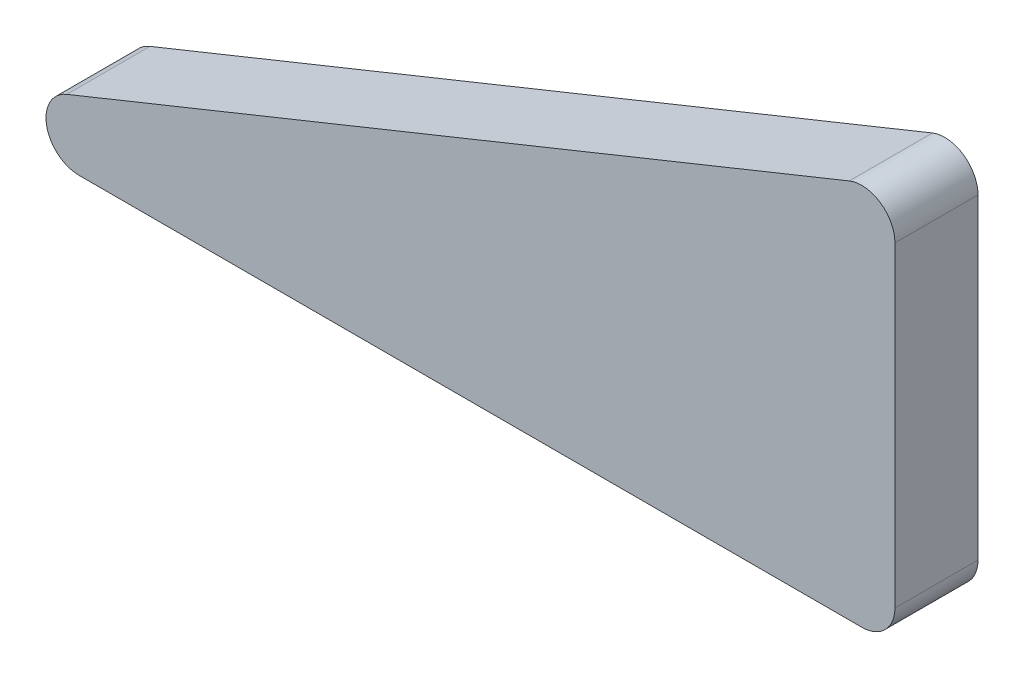
ISO-10303-21;
HEADER;
FILE_DESCRIPTION(('STEP AP214'),'2;1');
FILE_NAME('part.step','',(''),(''),'','','');
FILE_SCHEMA(('AUTOMOTIVE_DESIGN { 1 0 10303 214 1 1 1 1 }'));
ENDSEC;
DATA;
#1=APPLICATION_CONTEXT('core data for automotive mechanical design processes');
#2=APPLICATION_PROTOCOL_DEFINITION('international standard','automotive_design',2000,#1);
#3=PRODUCT_CONTEXT('',#1,'mechanical');
#4=PRODUCT('Part','Part','',(#3));
#5=PRODUCT_RELATED_PRODUCT_CATEGORY('part','',(#4));
#6=PRODUCT_DEFINITION_FORMATION('','',#4);
#7=PRODUCT_DEFINITION_CONTEXT('part definition',#1,'design');
#8=PRODUCT_DEFINITION('design','',#6,#7);
#9=PRODUCT_DEFINITION_SHAPE('','',#8);
#10=(LENGTH_UNIT() NAMED_UNIT(*) SI_UNIT(.MILLI.,.METRE.));
#11=(NAMED_UNIT(*) PLANE_ANGLE_UNIT() SI_UNIT($,.RADIAN.));
#12=(NAMED_UNIT(*) SI_UNIT($,.STERADIAN.) SOLID_ANGLE_UNIT());
#13=UNCERTAINTY_MEASURE_WITH_UNIT(LENGTH_MEASURE(1.E-05),#10,'distance_accuracy_value','');
#14=(GEOMETRIC_REPRESENTATION_CONTEXT(3) GLOBAL_UNCERTAINTY_ASSIGNED_CONTEXT((#13)) GLOBAL_UNIT_ASSIGNED_CONTEXT((#10,
#11,#12)) REPRESENTATION_CONTEXT('',''));
#15=CARTESIAN_POINT('',(0.,0.,0.));
#16=DIRECTION('',(0.,0.,1.));
#17=DIRECTION('',(1.,0.,0.));
#18=AXIS2_PLACEMENT_3D('',#15,#16,#17);
#19=CARTESIAN_POINT('',(28.69165592,10.5172634555305,2.5));
#20=DIRECTION('',(0.,0.,-1.));
#21=DIRECTION('',(-1.,0.,0.));
#22=AXIS2_PLACEMENT_3D('',#19,#20,#21);
#23=CYLINDRICAL_SURFACE('',#22,1.);
#24=CARTESIAN_POINT('',(28.69165592,10.5172634555305,0.));
#25=DIRECTION('',(0.,0.,1.));
#26=DIRECTION('',(1.,0.,0.));
#27=AXIS2_PLACEMENT_3D('',#24,#25,#26);
#28=CIRCLE('',#27,1.);
#29=CARTESIAN_POINT('',(29.69165592,10.5172634555305,0.));
#30=VERTEX_POINT('',#29);
#31=CARTESIAN_POINT('',(28.3169475285901,11.4444061745372,0.));
#32=VERTEX_POINT('',#31);
#33=EDGE_CURVE('E115',#30,#32,#28,.T.);
#34=ORIENTED_EDGE('',*,*,#33,.T.);
#35=DIRECTION('',(0.,0.,-1.));
#36=VECTOR('',#35,1.);
#37=CARTESIAN_POINT('',(28.3169475285901,11.4444061745372,2.5));
#38=LINE('',#37,#36);
#39=CARTESIAN_POINT('',(28.3169475285901,11.4444061745372,2.5));
#40=VERTEX_POINT('',#39);
#41=EDGE_CURVE('E11',#40,#32,#38,.T.);
#42=ORIENTED_EDGE('',*,*,#41,.F.);
#43=CARTESIAN_POINT('',(28.69165592,10.5172634555305,2.5));
#44=DIRECTION('',(0.,0.,1.));
#45=DIRECTION('',(1.,0.,0.));
#46=AXIS2_PLACEMENT_3D('',#43,#44,#45);
#47=CIRCLE('',#46,1.);
#48=CARTESIAN_POINT('',(29.69165592,10.5172634555305,2.5));
#49=VERTEX_POINT('',#48);
#50=EDGE_CURVE('E127',#49,#40,#47,.T.);
#51=ORIENTED_EDGE('',*,*,#50,.F.);
#52=DIRECTION('',(0.,0.,-1.));
#53=VECTOR('',#52,1.);
#54=CARTESIAN_POINT('',(29.69165592,10.5172634555305,2.5));
#55=LINE('',#54,#53);
#56=EDGE_CURVE('E111',#49,#30,#55,.T.);
#57=ORIENTED_EDGE('',*,*,#56,.T.);
#58=EDGE_LOOP('',(#34,#42,#51,#57));
#59=FACE_BOUND('',#58,.T.);
#60=ADVANCED_FACE('F32',(#59),#23,.T.);
#61=CARTESIAN_POINT('',(28.3169475285901,11.4444061745372,2.5));
#62=DIRECTION('',(0.374708391409904,-0.927142719006628,0.));
#63=DIRECTION('',(0.927142719006628,0.374708391409904,0.));
#64=AXIS2_PLACEMENT_3D('',#61,#62,#63);
#65=PLANE('',#64);
#66=DIRECTION('',(-0.927142719006628,-0.374708391409904,0.));
#67=VECTOR('',#66,1.);
#68=CARTESIAN_POINT('',(28.3169475285901,11.4444061745372,0.));
#69=LINE('',#68,#67);
#70=CARTESIAN_POINT('',(4.76833821012317,1.92714271900663,0.));
#71=VERTEX_POINT('',#70);
#72=EDGE_CURVE('E118',#32,#71,#69,.T.);
#73=ORIENTED_EDGE('',*,*,#72,.T.);
#74=DIRECTION('',(0.,0.,-1.));
#75=VECTOR('',#74,1.);
#76=CARTESIAN_POINT('',(4.76833821012317,1.92714271900663,2.5));
#77=LINE('',#76,#75);
#78=CARTESIAN_POINT('',(4.76833821012317,1.92714271900663,2.5));
#79=VERTEX_POINT('',#78);
#80=EDGE_CURVE('E40',#79,#71,#77,.T.);
#81=ORIENTED_EDGE('',*,*,#80,.F.);
#82=DIRECTION('',(-0.927142719006628,-0.374708391409904,0.));
#83=VECTOR('',#82,1.);
#84=CARTESIAN_POINT('',(28.3169475285901,11.4444061745372,2.5));
#85=LINE('',#84,#83);
#86=EDGE_CURVE('E85',#40,#79,#85,.T.);
#87=ORIENTED_EDGE('',*,*,#86,.F.);
#88=ORIENTED_EDGE('',*,*,#41,.T.);
#89=EDGE_LOOP('',(#73,#81,#87,#88));
#90=FACE_BOUND('',#89,.T.);
#91=ADVANCED_FACE('F133',(#90),#65,.F.);
#92=CARTESIAN_POINT('',(5.14304660153307,1.,2.5));
#93=DIRECTION('',(0.,0.,-1.));
#94=DIRECTION('',(-1.,0.,0.));
#95=AXIS2_PLACEMENT_3D('',#92,#93,#94);
#96=CYLINDRICAL_SURFACE('',#95,1.);
#97=CARTESIAN_POINT('',(5.14304660153307,1.,0.));
#98=DIRECTION('',(0.,0.,-1.));
#99=DIRECTION('',(-1.,0.,0.));
#100=AXIS2_PLACEMENT_3D('',#97,#98,#99);
#101=CIRCLE('',#100,1.);
#102=CARTESIAN_POINT('',(5.14304660153307,0.,0.));
#103=VERTEX_POINT('',#102);
#104=EDGE_CURVE('E121',#103,#71,#101,.T.);
#105=ORIENTED_EDGE('',*,*,#104,.F.);
#106=DIRECTION('',(0.,0.,-1.));
#107=VECTOR('',#106,1.);
#108=CARTESIAN_POINT('',(5.14304660153307,0.,2.5));
#109=LINE('',#108,#107);
#110=CARTESIAN_POINT('',(5.14304660153307,0.,2.5));
#111=VERTEX_POINT('',#110);
#112=EDGE_CURVE('E106',#111,#103,#109,.T.);
#113=ORIENTED_EDGE('',*,*,#112,.F.);
#114=CARTESIAN_POINT('',(5.14304660153307,1.,2.5));
#115=DIRECTION('',(0.,0.,-1.));
#116=DIRECTION('',(-1.,0.,0.));
#117=AXIS2_PLACEMENT_3D('',#114,#115,#116);
#118=CIRCLE('',#117,1.);
#119=EDGE_CURVE('E99',#111,#79,#118,.T.);
#120=ORIENTED_EDGE('',*,*,#119,.T.);
#121=ORIENTED_EDGE('',*,*,#80,.T.);
#122=EDGE_LOOP('',(#105,#113,#120,#121));
#123=FACE_BOUND('',#122,.T.);
#124=ADVANCED_FACE('F132',(#123),#96,.T.);
#125=CARTESIAN_POINT('',(5.14304660153307,0.,2.5));
#126=DIRECTION('',(0.,1.,0.));
#127=DIRECTION('',(-1.,0.,0.));
#128=AXIS2_PLACEMENT_3D('',#125,#126,#127);
#129=PLANE('',#128);
#130=DIRECTION('',(1.,0.,0.));
#131=VECTOR('',#130,1.);
#132=CARTESIAN_POINT('',(5.14304660153307,0.,0.));
#133=LINE('',#132,#131);
#134=CARTESIAN_POINT('',(28.69165592,0.,0.));
#135=VERTEX_POINT('',#134);
#136=EDGE_CURVE('E105',#103,#135,#133,.T.);
#137=ORIENTED_EDGE('',*,*,#136,.T.);
#138=DIRECTION('',(0.,0.,-1.));
#139=VECTOR('',#138,1.);
#140=CARTESIAN_POINT('',(28.69165592,0.,2.5));
#141=LINE('',#140,#139);
#142=CARTESIAN_POINT('',(28.69165592,0.,2.5));
#143=VERTEX_POINT('',#142);
#144=EDGE_CURVE('E102',#143,#135,#141,.T.);
#145=ORIENTED_EDGE('',*,*,#144,.F.);
#146=DIRECTION('',(1.,0.,0.));
#147=VECTOR('',#146,1.);
#148=CARTESIAN_POINT('',(5.14304660153307,0.,2.5));
#149=LINE('',#148,#147);
#150=EDGE_CURVE('E93',#111,#143,#149,.T.);
#151=ORIENTED_EDGE('',*,*,#150,.F.);
#152=ORIENTED_EDGE('',*,*,#112,.T.);
#153=EDGE_LOOP('',(#137,#145,#151,#152));
#154=FACE_BOUND('',#153,.T.);
#155=ADVANCED_FACE('F103',(#154),#129,.F.);
#156=CARTESIAN_POINT('',(28.69165592,1.,2.5));
#157=DIRECTION('',(0.,0.,-1.));
#158=DIRECTION('',(-1.,0.,0.));
#159=AXIS2_PLACEMENT_3D('',#156,#157,#158);
#160=CYLINDRICAL_SURFACE('',#159,1.);
#161=CARTESIAN_POINT('',(28.69165592,1.,0.));
#162=DIRECTION('',(0.,0.,1.));
#163=DIRECTION('',(1.,0.,0.));
#164=AXIS2_PLACEMENT_3D('',#161,#162,#163);
#165=CIRCLE('',#164,1.);
#166=CARTESIAN_POINT('',(29.69165592,1.,0.));
#167=VERTEX_POINT('',#166);
#168=EDGE_CURVE('E71',#135,#167,#165,.T.);
#169=ORIENTED_EDGE('',*,*,#168,.T.);
#170=DIRECTION('',(0.,0.,-1.));
#171=VECTOR('',#170,1.);
#172=CARTESIAN_POINT('',(29.69165592,1.,2.5));
#173=LINE('',#172,#171);
#174=CARTESIAN_POINT('',(29.69165592,1.,2.5));
#175=VERTEX_POINT('',#174);
#176=EDGE_CURVE('E107',#175,#167,#173,.T.);
#177=ORIENTED_EDGE('',*,*,#176,.F.);
#178=CARTESIAN_POINT('',(28.69165592,1.,2.5));
#179=DIRECTION('',(0.,0.,1.));
#180=DIRECTION('',(1.,0.,0.));
#181=AXIS2_PLACEMENT_3D('',#178,#179,#180);
#182=CIRCLE('',#181,1.);
#183=EDGE_CURVE('E97',#143,#175,#182,.T.);
#184=ORIENTED_EDGE('',*,*,#183,.F.);
#185=ORIENTED_EDGE('',*,*,#144,.T.);
#186=EDGE_LOOP('',(#169,#177,#184,#185));
#187=FACE_BOUND('',#186,.T.);
#188=ADVANCED_FACE('F109',(#187),#160,.T.);
#189=CARTESIAN_POINT('',(29.69165592,1.,2.5));
#190=DIRECTION('',(-1.,0.,0.));
#191=DIRECTION('',(0.,0.,1.));
#192=AXIS2_PLACEMENT_3D('',#189,#190,#191);
#193=PLANE('',#192);
#194=DIRECTION('',(0.,1.,0.));
#195=VECTOR('',#194,1.);
#196=CARTESIAN_POINT('',(29.69165592,1.,0.));
#197=LINE('',#196,#195);
#198=EDGE_CURVE('E77',#167,#30,#197,.T.);
#199=ORIENTED_EDGE('',*,*,#198,.T.);
#200=ORIENTED_EDGE('',*,*,#56,.F.);
#201=DIRECTION('',(0.,1.,0.));
#202=VECTOR('',#201,1.);
#203=CARTESIAN_POINT('',(29.69165592,1.,2.5));
#204=LINE('',#203,#202);
#205=EDGE_CURVE('E48',#175,#49,#204,.T.);
#206=ORIENTED_EDGE('',*,*,#205,.F.);
#207=ORIENTED_EDGE('',*,*,#176,.T.);
#208=EDGE_LOOP('',(#199,#200,#206,#207));
#209=FACE_BOUND('',#208,.T.);
#210=ADVANCED_FACE('F140',(#209),#193,.F.);
#211=CARTESIAN_POINT('',(28.69165592,10.5172634555305,2.5));
#212=DIRECTION('',(0.,0.,1.));
#213=DIRECTION('',(1.,0.,0.));
#214=AXIS2_PLACEMENT_3D('',#211,#212,#213);
#215=PLANE('',#214);
#216=ORIENTED_EDGE('',*,*,#50,.T.);
#217=ORIENTED_EDGE('',*,*,#86,.T.);
#218=ORIENTED_EDGE('',*,*,#119,.F.);
#219=ORIENTED_EDGE('',*,*,#150,.T.);
#220=ORIENTED_EDGE('',*,*,#183,.T.);
#221=ORIENTED_EDGE('',*,*,#205,.T.);
#222=EDGE_LOOP('',(#216,#217,#218,#219,#220,#221));
#223=FACE_BOUND('',#222,.T.);
#224=ADVANCED_FACE('F95',(#223),#215,.T.);
#225=CARTESIAN_POINT('',(28.69165592,10.5172634555305,0.));
#226=DIRECTION('',(0.,0.,1.));
#227=DIRECTION('',(1.,0.,0.));
#228=AXIS2_PLACEMENT_3D('',#225,#226,#227);
#229=PLANE('',#228);
#230=ORIENTED_EDGE('',*,*,#33,.F.);
#231=ORIENTED_EDGE('',*,*,#198,.F.);
#232=ORIENTED_EDGE('',*,*,#168,.F.);
#233=ORIENTED_EDGE('',*,*,#136,.F.);
#234=ORIENTED_EDGE('',*,*,#104,.T.);
#235=ORIENTED_EDGE('',*,*,#72,.F.);
#236=EDGE_LOOP('',(#230,#231,#232,#233,#234,#235));
#237=FACE_BOUND('',#236,.T.);
#238=ADVANCED_FACE('F137',(#237),#229,.F.);
#239=CLOSED_SHELL('',(#60,#91,#124,#155,#188,#210,#224,#238));
#240=MANIFOLD_SOLID_BREP('B2',#239);
#241=ADVANCED_BREP_SHAPE_REPRESENTATION('',(#18,#240),#14);
#242=SHAPE_DEFINITION_REPRESENTATION(#9,#241);
ENDSEC;
END-ISO-10303-21;
